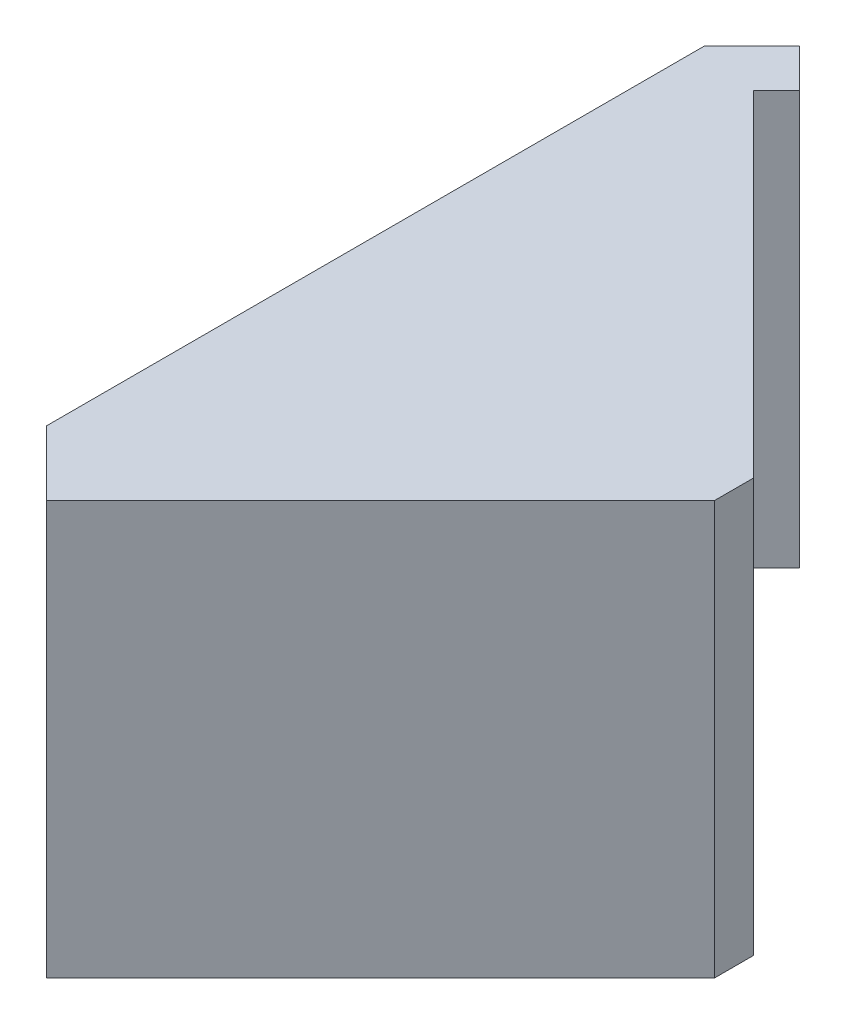
ISO-10303-21;
HEADER;
FILE_DESCRIPTION(('STEP AP214'),'2;1');
FILE_NAME('part.step','',(''),(''),'','','');
FILE_SCHEMA(('AUTOMOTIVE_DESIGN { 1 0 10303 214 1 1 1 1 }'));
ENDSEC;
DATA;
#1=APPLICATION_CONTEXT('core data for automotive mechanical design processes');
#2=APPLICATION_PROTOCOL_DEFINITION('international standard','automotive_design',2000,#1);
#3=PRODUCT_CONTEXT('',#1,'mechanical');
#4=PRODUCT('Part','Part','',(#3));
#5=PRODUCT_RELATED_PRODUCT_CATEGORY('part','',(#4));
#6=PRODUCT_DEFINITION_FORMATION('','',#4);
#7=PRODUCT_DEFINITION_CONTEXT('part definition',#1,'design');
#8=PRODUCT_DEFINITION('design','',#6,#7);
#9=PRODUCT_DEFINITION_SHAPE('','',#8);
#10=(LENGTH_UNIT() NAMED_UNIT(*) SI_UNIT(.MILLI.,.METRE.));
#11=(NAMED_UNIT(*) PLANE_ANGLE_UNIT() SI_UNIT($,.RADIAN.));
#12=(NAMED_UNIT(*) SI_UNIT($,.STERADIAN.) SOLID_ANGLE_UNIT());
#13=UNCERTAINTY_MEASURE_WITH_UNIT(LENGTH_MEASURE(1.E-05),#10,'distance_accuracy_value','');
#14=(GEOMETRIC_REPRESENTATION_CONTEXT(3) GLOBAL_UNCERTAINTY_ASSIGNED_CONTEXT((#13)) GLOBAL_UNIT_ASSIGNED_CONTEXT((#10,
#11,#12)) REPRESENTATION_CONTEXT('',''));
#15=CARTESIAN_POINT('',(0.,0.,0.));
#16=DIRECTION('',(0.,0.,1.));
#17=DIRECTION('',(1.,0.,0.));
#18=AXIS2_PLACEMENT_3D('',#15,#16,#17);
#19=CARTESIAN_POINT('',(4.97918471982982,32.0001686510857,66.916739326351));
#20=DIRECTION('',(-0.707106781186536,0.,0.70710678118656));
#21=DIRECTION('',(0.,1.,0.));
#22=AXIS2_PLACEMENT_3D('',#19,#20,#21);
#23=PLANE('',#22);
#24=DIRECTION('',(0.,1.,0.));
#25=VECTOR('',#24,1.);
#26=CARTESIAN_POINT('',(20.8890872965275,42.0001686510856,82.8266419030482));
#27=LINE('',#26,#25);
#28=CARTESIAN_POINT('',(20.8890872965275,12.0001686510856,82.8266419030482));
#29=VERTEX_POINT('',#28);
#30=CARTESIAN_POINT('',(20.8890872965276,52.0001686510856,82.8266419030482));
#31=VERTEX_POINT('',#30);
#32=EDGE_CURVE('E112',#29,#31,#27,.T.);
#33=ORIENTED_EDGE('',*,*,#32,.F.);
#34=DIRECTION('',(0.70710678118656,0.,0.707106781186536));
#35=VECTOR('',#34,1.);
#36=CARTESIAN_POINT('',(-1.03122292025595,12.0001686510857,60.9063316862655));
#37=LINE('',#36,#35);
#38=CARTESIAN_POINT('',(27.1469823100283,12.0001686510856,89.0845369165488));
#39=VERTEX_POINT('',#38);
#40=EDGE_CURVE('E142',#29,#39,#37,.T.);
#41=ORIENTED_EDGE('',*,*,#40,.T.);
#42=DIRECTION('',(0.,1.,0.));
#43=VECTOR('',#42,1.);
#44=CARTESIAN_POINT('',(27.1469823100283,22.0001686510856,89.0845369165488));
#45=LINE('',#44,#43);
#46=CARTESIAN_POINT('',(27.1469823100284,52.0001686510856,89.0845369165488));
#47=VERTEX_POINT('',#46);
#48=EDGE_CURVE('E11',#39,#47,#45,.T.);
#49=ORIENTED_EDGE('',*,*,#48,.T.);
#50=DIRECTION('',(-0.70710678118656,0.,-0.707106781186536));
#51=VECTOR('',#50,1.);
#52=CARTESIAN_POINT('',(10.9895923599156,52.0001686510856,72.9271469664365));
#53=LINE('',#52,#51);
#54=EDGE_CURVE('E168',#47,#31,#53,.T.);
#55=ORIENTED_EDGE('',*,*,#54,.T.);
#56=EDGE_LOOP('',(#33,#41,#49,#55));
#57=FACE_BOUND('',#56,.T.);
#58=ADVANCED_FACE('F17',(#57),#23,.T.);
#59=CARTESIAN_POINT('',(61.4416611975753,12.0001686510855,54.7898580290007));
#60=DIRECTION('',(0.70710678118656,0.,0.707106781186536));
#61=DIRECTION('',(0.,-1.,0.));
#62=AXIS2_PLACEMENT_3D('',#59,#60,#61);
#63=PLANE('',#62);
#64=DIRECTION('',(0.,1.,0.));
#65=VECTOR('',#64,1.);
#66=CARTESIAN_POINT('',(59.4540764008568,31.0000843255425,56.7774428257193));
#67=LINE('',#66,#65);
#68=CARTESIAN_POINT('',(59.4540764008568,12.0001686510855,56.7774428257193));
#69=VERTEX_POINT('',#68);
#70=CARTESIAN_POINT('',(59.4540764008568,52.0001686510855,56.7774428257193));
#71=VERTEX_POINT('',#70);
#72=EDGE_CURVE('E134',#69,#71,#67,.T.);
#73=ORIENTED_EDGE('',*,*,#72,.T.);
#74=DIRECTION('',(-0.707106781186536,0.,0.70710678118656));
#75=VECTOR('',#74,1.);
#76=CARTESIAN_POINT('',(61.4416611975754,52.0001686510855,54.7898580290007));
#77=LINE('',#76,#75);
#78=EDGE_CURVE('E171',#71,#47,#77,.T.);
#79=ORIENTED_EDGE('',*,*,#78,.T.);
#80=ORIENTED_EDGE('',*,*,#48,.F.);
#81=DIRECTION('',(-0.707106781186536,0.,0.70710678118656));
#82=VECTOR('',#81,1.);
#83=CARTESIAN_POINT('',(61.4416611975753,12.0001686510855,54.7898580290007));
#84=LINE('',#83,#82);
#85=EDGE_CURVE('E138',#69,#39,#84,.T.);
#86=ORIENTED_EDGE('',*,*,#85,.F.);
#87=EDGE_LOOP('',(#73,#79,#80,#86));
#88=FACE_BOUND('',#87,.T.);
#89=ADVANCED_FACE('F19',(#88),#63,.T.);
#90=CARTESIAN_POINT('',(41.3951839509364,32.0001686510855,30.5007400952432));
#91=DIRECTION('',(-0.707106781186536,0.,0.70710678118656));
#92=DIRECTION('',(0.,1.,0.));
#93=AXIS2_PLACEMENT_3D('',#90,#91,#92);
#94=PLANE('',#93);
#95=DIRECTION('',(0.,-1.,0.));
#96=VECTOR('',#95,1.);
#97=CARTESIAN_POINT('',(29.1975919754682,32.0001686510856,18.3031481197754));
#98=LINE('',#97,#96);
#99=CARTESIAN_POINT('',(29.1975919754682,52.0001686510856,18.3031481197754));
#100=VERTEX_POINT('',#99);
#101=CARTESIAN_POINT('',(29.1975919754681,12.0001686510856,18.3031481197754));
#102=VERTEX_POINT('',#101);
#103=EDGE_CURVE('E26',#100,#102,#98,.T.);
#104=ORIENTED_EDGE('',*,*,#103,.T.);
#105=DIRECTION('',(0.70710678118656,0.,0.707106781186536));
#106=VECTOR('',#105,1.);
#107=CARTESIAN_POINT('',(35.3847763108506,12.0001686510856,24.4903324551577));
#108=LINE('',#107,#106);
#109=CARTESIAN_POINT('',(25.4852813742389,12.0001686510856,14.5908375185463));
#110=VERTEX_POINT('',#109);
#111=EDGE_CURVE('E110',#110,#102,#108,.T.);
#112=ORIENTED_EDGE('',*,*,#111,.F.);
#113=DIRECTION('',(0.,-1.,0.));
#114=VECTOR('',#113,1.);
#115=CARTESIAN_POINT('',(25.485281374239,42.0001686510856,14.5908375185463));
#116=LINE('',#115,#114);
#117=CARTESIAN_POINT('',(25.485281374239,52.0001686510856,14.5908375185463));
#118=VERTEX_POINT('',#117);
#119=EDGE_CURVE('E165',#118,#110,#116,.T.);
#120=ORIENTED_EDGE('',*,*,#119,.F.);
#121=DIRECTION('',(-0.70710678118656,0.,-0.707106781186536));
#122=VECTOR('',#121,1.);
#123=CARTESIAN_POINT('',(47.4055915910222,52.0001686510855,36.5111477353287));
#124=LINE('',#123,#122);
#125=EDGE_CURVE('E176',#100,#118,#124,.T.);
#126=ORIENTED_EDGE('',*,*,#125,.F.);
#127=EDGE_LOOP('',(#104,#112,#120,#126));
#128=FACE_BOUND('',#127,.T.);
#129=ADVANCED_FACE('F181',(#128),#94,.F.);
#130=CARTESIAN_POINT('',(18.5909902576702,32.0001686510856,28.9097498375736));
#131=DIRECTION('',(-0.707106781186553,0.,-0.707106781186542));
#132=DIRECTION('',(-0.707106781186542,0.,0.707106781186553));
#133=AXIS2_PLACEMENT_3D('',#130,#131,#132);
#134=PLANE('',#133);
#135=DIRECTION('',(0.,-1.,0.));
#136=VECTOR('',#135,1.);
#137=CARTESIAN_POINT('',(26.9702056147306,32.0001686510856,20.5305344805131));
#138=LINE('',#137,#136);
#139=CARTESIAN_POINT('',(26.9702056147306,52.0001686510856,20.5305344805131));
#140=VERTEX_POINT('',#139);
#141=CARTESIAN_POINT('',(26.9702056147305,12.0001686510856,20.5305344805131));
#142=VERTEX_POINT('',#141);
#143=EDGE_CURVE('E115',#140,#142,#138,.T.);
#144=ORIENTED_EDGE('',*,*,#143,.T.);
#145=DIRECTION('',(-0.707106781186542,0.,0.707106781186553));
#146=VECTOR('',#145,1.);
#147=CARTESIAN_POINT('',(22.8336309447893,12.0001686510856,24.6671091504543));
#148=LINE('',#147,#146);
#149=EDGE_CURVE('E101',#102,#142,#148,.T.);
#150=ORIENTED_EDGE('',*,*,#149,.F.);
#151=ORIENTED_EDGE('',*,*,#103,.F.);
#152=DIRECTION('',(0.707106781186542,0.,-0.707106781186553));
#153=VECTOR('',#152,1.);
#154=CARTESIAN_POINT('',(22.8336309447895,52.0001686510856,24.6671091504542));
#155=LINE('',#154,#153);
#156=EDGE_CURVE('E118',#140,#100,#155,.T.);
#157=ORIENTED_EDGE('',*,*,#156,.F.);
#158=EDGE_LOOP('',(#144,#150,#151,#157));
#159=FACE_BOUND('',#158,.T.);
#160=ADVANCED_FACE('F116',(#159),#134,.F.);
#161=CARTESIAN_POINT('',(51.2946788875483,52.0001686510855,44.6428757189739));
#162=DIRECTION('',(0.,1.,0.));
#163=DIRECTION('',(1.,0.,0.));
#164=AXIS2_PLACEMENT_3D('',#161,#162,#163);
#165=PLANE('',#164);
#166=DIRECTION('',(0.,0.,-1.));
#167=VECTOR('',#166,1.);
#168=CARTESIAN_POINT('',(20.889087296527,52.0001686510856,47.824856234314));
#169=LINE('',#168,#167);
#170=CARTESIAN_POINT('',(20.8890872965265,52.0001686510856,19.1870315962589));
#171=VERTEX_POINT('',#170);
#172=EDGE_CURVE('E143',#31,#171,#169,.T.);
#173=ORIENTED_EDGE('',*,*,#172,.F.);
#174=ORIENTED_EDGE('',*,*,#54,.F.);
#175=ORIENTED_EDGE('',*,*,#78,.F.);
#176=DIRECTION('',(0.,0.,-1.));
#177=VECTOR('',#176,1.);
#178=CARTESIAN_POINT('',(59.4540764008567,52.0001686510855,44.7693996590592));
#179=LINE('',#178,#177);
#180=CARTESIAN_POINT('',(59.4540764008568,52.0001686510855,53.0144052666381));
#181=VERTEX_POINT('',#180);
#182=EDGE_CURVE('E189',#71,#181,#179,.T.);
#183=ORIENTED_EDGE('',*,*,#182,.T.);
#184=DIRECTION('',(-0.70710678118656,0.,-0.707106781186536));
#185=VECTOR('',#184,1.);
#186=CARTESIAN_POINT('',(45.1782052302846,52.0001686510855,38.7385340960664));
#187=LINE('',#186,#185);
#188=EDGE_CURVE('E122',#181,#140,#187,.T.);
#189=ORIENTED_EDGE('',*,*,#188,.T.);
#190=ORIENTED_EDGE('',*,*,#156,.T.);
#191=ORIENTED_EDGE('',*,*,#125,.T.);
#192=DIRECTION('',(-0.707106781186536,0.,0.70710678118656));
#193=VECTOR('',#192,1.);
#194=CARTESIAN_POINT('',(23.3639610306794,52.0001686510856,16.712157862106));
#195=LINE('',#194,#193);
#196=EDGE_CURVE('E153',#118,#171,#195,.T.);
#197=ORIENTED_EDGE('',*,*,#196,.T.);
#198=EDGE_LOOP('',(#173,#174,#175,#183,#189,#190,#191,#197));
#199=FACE_BOUND('',#198,.T.);
#200=ADVANCED_FACE('F186',(#199),#165,.T.);
#201=CARTESIAN_POINT('',(23.3639610306794,52.0001686510856,16.712157862106));
#202=DIRECTION('',(-0.70710678118656,0.,-0.707106781186536));
#203=DIRECTION('',(-0.707106781186536,0.,0.70710678118656));
#204=AXIS2_PLACEMENT_3D('',#201,#202,#203);
#205=PLANE('',#204);
#206=DIRECTION('',(0.,-1.,0.));
#207=VECTOR('',#206,1.);
#208=CARTESIAN_POINT('',(20.8890872965265,42.0001686510856,19.1870315962589));
#209=LINE('',#208,#207);
#210=CARTESIAN_POINT('',(20.8890872965264,12.0001686510856,19.1870315962589));
#211=VERTEX_POINT('',#210);
#212=EDGE_CURVE('E147',#171,#211,#209,.T.);
#213=ORIENTED_EDGE('',*,*,#212,.F.);
#214=ORIENTED_EDGE('',*,*,#196,.F.);
#215=ORIENTED_EDGE('',*,*,#119,.T.);
#216=DIRECTION('',(-0.707106781186536,0.,0.70710678118656));
#217=VECTOR('',#216,1.);
#218=CARTESIAN_POINT('',(23.3639610306792,12.0001686510856,16.712157862106));
#219=LINE('',#218,#217);
#220=EDGE_CURVE('E157',#110,#211,#219,.T.);
#221=ORIENTED_EDGE('',*,*,#220,.T.);
#222=EDGE_LOOP('',(#213,#214,#215,#221));
#223=FACE_BOUND('',#222,.T.);
#224=ADVANCED_FACE('F213',(#223),#205,.T.);
#225=CARTESIAN_POINT('',(20.889087296527,42.0001686510856,51.0068367496536));
#226=DIRECTION('',(-1.,0.,0.));
#227=DIRECTION('',(0.,1.,0.));
#228=AXIS2_PLACEMENT_3D('',#225,#226,#227);
#229=PLANE('',#228);
#230=DIRECTION('',(0.,0.,1.));
#231=VECTOR('',#230,1.);
#232=CARTESIAN_POINT('',(20.8890872965267,12.0001686510856,35.8040409541428));
#233=LINE('',#232,#231);
#234=EDGE_CURVE('E150',#211,#29,#233,.T.);
#235=ORIENTED_EDGE('',*,*,#234,.T.);
#236=ORIENTED_EDGE('',*,*,#32,.T.);
#237=ORIENTED_EDGE('',*,*,#172,.T.);
#238=ORIENTED_EDGE('',*,*,#212,.T.);
#239=EDGE_LOOP('',(#235,#236,#237,#238));
#240=FACE_BOUND('',#239,.T.);
#241=ADVANCED_FACE('F210',(#240),#229,.T.);
#242=CARTESIAN_POINT('',(27.2530483272053,12.0001686510856,20.6012451586319));
#243=DIRECTION('',(0.,-1.,0.));
#244=DIRECTION('',(-1.,0.,0.));
#245=AXIS2_PLACEMENT_3D('',#242,#243,#244);
#246=PLANE('',#245);
#247=DIRECTION('',(0.,0.,-1.));
#248=VECTOR('',#247,1.);
#249=CARTESIAN_POINT('',(59.4540764008566,12.0001686510855,32.7485843788881));
#250=LINE('',#249,#248);
#251=CARTESIAN_POINT('',(59.4540764008567,12.0001686510855,53.0144052666382));
#252=VERTEX_POINT('',#251);
#253=EDGE_CURVE('E129',#69,#252,#250,.T.);
#254=ORIENTED_EDGE('',*,*,#253,.F.);
#255=ORIENTED_EDGE('',*,*,#85,.T.);
#256=ORIENTED_EDGE('',*,*,#40,.F.);
#257=ORIENTED_EDGE('',*,*,#234,.F.);
#258=ORIENTED_EDGE('',*,*,#220,.F.);
#259=ORIENTED_EDGE('',*,*,#111,.T.);
#260=ORIENTED_EDGE('',*,*,#149,.T.);
#261=DIRECTION('',(0.70710678118656,0.,0.707106781186536));
#262=VECTOR('',#261,1.);
#263=CARTESIAN_POINT('',(33.157389950113,12.0001686510856,26.7177188158954));
#264=LINE('',#263,#262);
#265=EDGE_CURVE('E106',#142,#252,#264,.T.);
#266=ORIENTED_EDGE('',*,*,#265,.T.);
#267=EDGE_LOOP('',(#254,#255,#256,#257,#258,#259,#260,#266));
#268=FACE_BOUND('',#267,.T.);
#269=ADVANCED_FACE('F104',(#268),#246,.T.);
#270=CARTESIAN_POINT('',(39.1677975901988,32.0001686510855,32.7281264559809));
#271=DIRECTION('',(-0.707106781186536,0.,0.70710678118656));
#272=DIRECTION('',(0.,1.,0.));
#273=AXIS2_PLACEMENT_3D('',#270,#271,#272);
#274=PLANE('',#273);
#275=DIRECTION('',(0.,-1.,0.));
#276=VECTOR('',#275,1.);
#277=CARTESIAN_POINT('',(59.4540764008568,41.0000843255426,53.0144052666381));
#278=LINE('',#277,#276);
#279=EDGE_CURVE('E127',#181,#252,#278,.T.);
#280=ORIENTED_EDGE('',*,*,#279,.T.);
#281=ORIENTED_EDGE('',*,*,#265,.F.);
#282=ORIENTED_EDGE('',*,*,#143,.F.);
#283=ORIENTED_EDGE('',*,*,#188,.F.);
#284=EDGE_LOOP('',(#280,#281,#282,#283));
#285=FACE_BOUND('',#284,.T.);
#286=ADVANCED_FACE('F125',(#285),#274,.F.);
#287=CARTESIAN_POINT('',(59.4540764008567,50.,44.8959235991445));
#288=DIRECTION('',(-1.,0.,0.));
#289=DIRECTION('',(0.,1.,0.));
#290=AXIS2_PLACEMENT_3D('',#287,#288,#289);
#291=PLANE('',#290);
#292=ORIENTED_EDGE('',*,*,#279,.F.);
#293=ORIENTED_EDGE('',*,*,#182,.F.);
#294=ORIENTED_EDGE('',*,*,#72,.F.);
#295=ORIENTED_EDGE('',*,*,#253,.T.);
#296=EDGE_LOOP('',(#292,#293,#294,#295));
#297=FACE_BOUND('',#296,.T.);
#298=ADVANCED_FACE('F196',(#297),#291,.F.);
#299=CLOSED_SHELL('',(#58,#89,#129,#160,#200,#224,#241,#269,#286,#298));
#300=MANIFOLD_SOLID_BREP('B1',#299);
#301=ADVANCED_BREP_SHAPE_REPRESENTATION('',(#18,#300),#14);
#302=SHAPE_DEFINITION_REPRESENTATION(#9,#301);
ENDSEC;
END-ISO-10303-21;
